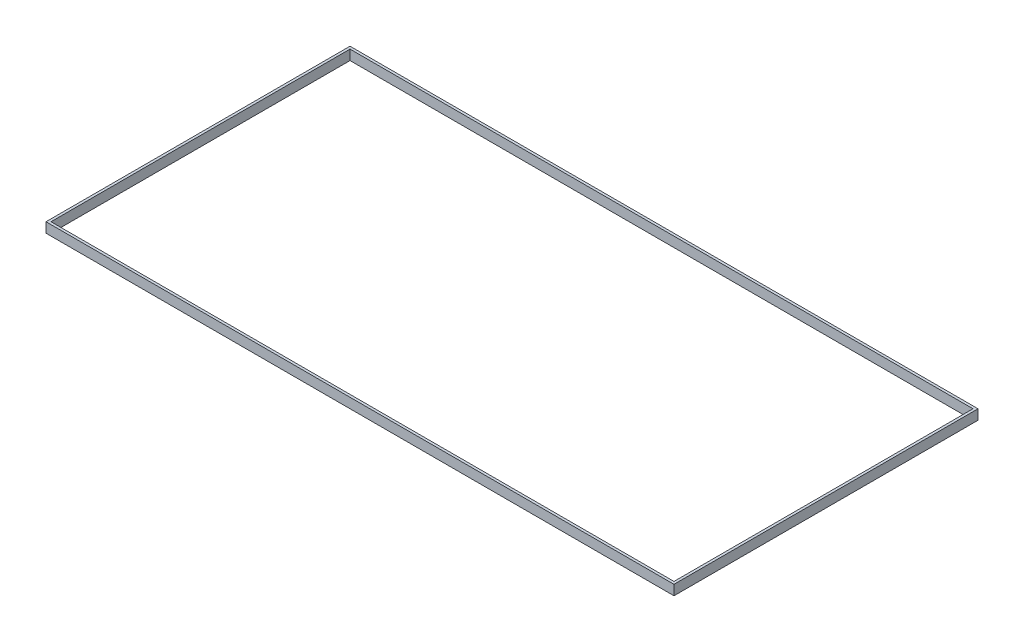
ISO-10303-21;
HEADER;
FILE_DESCRIPTION(('STEP AP214'),'2;1');
FILE_NAME('part.step','',(''),(''),'','','');
FILE_SCHEMA(('AUTOMOTIVE_DESIGN { 1 0 10303 214 1 1 1 1 }'));
ENDSEC;
DATA;
#1=APPLICATION_CONTEXT('core data for automotive mechanical design processes');
#2=APPLICATION_PROTOCOL_DEFINITION('international standard','automotive_design',2000,#1);
#3=PRODUCT_CONTEXT('',#1,'mechanical');
#4=PRODUCT('Part','Part','',(#3));
#5=PRODUCT_RELATED_PRODUCT_CATEGORY('part','',(#4));
#6=PRODUCT_DEFINITION_FORMATION('','',#4);
#7=PRODUCT_DEFINITION_CONTEXT('part definition',#1,'design');
#8=PRODUCT_DEFINITION('design','',#6,#7);
#9=PRODUCT_DEFINITION_SHAPE('','',#8);
#10=(LENGTH_UNIT() NAMED_UNIT(*) SI_UNIT(.MILLI.,.METRE.));
#11=(NAMED_UNIT(*) PLANE_ANGLE_UNIT() SI_UNIT($,.RADIAN.));
#12=(NAMED_UNIT(*) SI_UNIT($,.STERADIAN.) SOLID_ANGLE_UNIT());
#13=UNCERTAINTY_MEASURE_WITH_UNIT(LENGTH_MEASURE(1.E-05),#10,'distance_accuracy_value','');
#14=(GEOMETRIC_REPRESENTATION_CONTEXT(3) GLOBAL_UNCERTAINTY_ASSIGNED_CONTEXT((#13)) GLOBAL_UNIT_ASSIGNED_CONTEXT((#10,
#11,#12)) REPRESENTATION_CONTEXT('',''));
#15=CARTESIAN_POINT('',(0.,0.,0.));
#16=DIRECTION('',(0.,0.,1.));
#17=DIRECTION('',(1.,0.,0.));
#18=AXIS2_PLACEMENT_3D('',#15,#16,#17);
#19=CARTESIAN_POINT('',(0.,20.,0.));
#20=DIRECTION('',(0.,1.,0.));
#21=DIRECTION('',(0.,0.,1.));
#22=AXIS2_PLACEMENT_3D('',#19,#20,#21);
#23=PLANE('',#22);
#24=DIRECTION('',(0.,0.,1.));
#25=VECTOR('',#24,1.);
#26=CARTESIAN_POINT('',(-630.,20.,305.));
#27=LINE('',#26,#25);
#28=CARTESIAN_POINT('',(-630.,20.,-305.));
#29=VERTEX_POINT('',#28);
#30=CARTESIAN_POINT('',(-630.,20.,305.));
#31=VERTEX_POINT('',#30);
#32=EDGE_CURVE('E134',#29,#31,#27,.T.);
#33=ORIENTED_EDGE('',*,*,#32,.T.);
#34=DIRECTION('',(1.,0.,0.));
#35=VECTOR('',#34,1.);
#36=CARTESIAN_POINT('',(630.,20.,305.));
#37=LINE('',#36,#35);
#38=CARTESIAN_POINT('',(630.,20.,305.));
#39=VERTEX_POINT('',#38);
#40=EDGE_CURVE('E137',#31,#39,#37,.T.);
#41=ORIENTED_EDGE('',*,*,#40,.T.);
#42=DIRECTION('',(0.,0.,-1.));
#43=VECTOR('',#42,1.);
#44=CARTESIAN_POINT('',(630.,20.,305.));
#45=LINE('',#44,#43);
#46=CARTESIAN_POINT('',(630.,20.,-305.));
#47=VERTEX_POINT('',#46);
#48=EDGE_CURVE('E140',#39,#47,#45,.T.);
#49=ORIENTED_EDGE('',*,*,#48,.T.);
#50=DIRECTION('',(-1.,0.,0.));
#51=VECTOR('',#50,1.);
#52=CARTESIAN_POINT('',(630.,20.,-305.));
#53=LINE('',#52,#51);
#54=EDGE_CURVE('E142',#47,#29,#53,.T.);
#55=ORIENTED_EDGE('',*,*,#54,.T.);
#56=EDGE_LOOP('',(#33,#41,#49,#55));
#57=FACE_BOUND('',#56,.T.);
#58=DIRECTION('',(1.,0.,0.));
#59=VECTOR('',#58,1.);
#60=CARTESIAN_POINT('',(625.,20.,300.));
#61=LINE('',#60,#59);
#62=CARTESIAN_POINT('',(-625.,20.,300.));
#63=VERTEX_POINT('',#62);
#64=CARTESIAN_POINT('',(625.,20.,300.));
#65=VERTEX_POINT('',#64);
#66=EDGE_CURVE('E106',#63,#65,#61,.T.);
#67=ORIENTED_EDGE('',*,*,#66,.F.);
#68=DIRECTION('',(0.,0.,1.));
#69=VECTOR('',#68,1.);
#70=CARTESIAN_POINT('',(-625.,20.,300.));
#71=LINE('',#70,#69);
#72=CARTESIAN_POINT('',(-625.,20.,-300.));
#73=VERTEX_POINT('',#72);
#74=EDGE_CURVE('E98',#73,#63,#71,.T.);
#75=ORIENTED_EDGE('',*,*,#74,.F.);
#76=DIRECTION('',(-1.,0.,0.));
#77=VECTOR('',#76,1.);
#78=CARTESIAN_POINT('',(625.,20.,-300.));
#79=LINE('',#78,#77);
#80=CARTESIAN_POINT('',(625.,20.,-300.));
#81=VERTEX_POINT('',#80);
#82=EDGE_CURVE('E120',#81,#73,#79,.T.);
#83=ORIENTED_EDGE('',*,*,#82,.F.);
#84=DIRECTION('',(0.,0.,-1.));
#85=VECTOR('',#84,1.);
#86=CARTESIAN_POINT('',(625.,20.,300.));
#87=LINE('',#86,#85);
#88=EDGE_CURVE('E118',#65,#81,#87,.T.);
#89=ORIENTED_EDGE('',*,*,#88,.F.);
#90=EDGE_LOOP('',(#67,#75,#83,#89));
#91=FACE_BOUND('',#90,.T.);
#92=ADVANCED_FACE('F33',(#57,#91),#23,.T.);
#93=CARTESIAN_POINT('',(0.,0.,0.));
#94=DIRECTION('',(0.,1.,0.));
#95=DIRECTION('',(0.,0.,1.));
#96=AXIS2_PLACEMENT_3D('',#93,#94,#95);
#97=PLANE('',#96);
#98=DIRECTION('',(0.,0.,1.));
#99=VECTOR('',#98,1.);
#100=CARTESIAN_POINT('',(-630.,0.,305.));
#101=LINE('',#100,#99);
#102=CARTESIAN_POINT('',(-630.,0.,-305.));
#103=VERTEX_POINT('',#102);
#104=CARTESIAN_POINT('',(-630.,0.,305.));
#105=VERTEX_POINT('',#104);
#106=EDGE_CURVE('E114',#103,#105,#101,.T.);
#107=ORIENTED_EDGE('',*,*,#106,.F.);
#108=DIRECTION('',(-1.,0.,0.));
#109=VECTOR('',#108,1.);
#110=CARTESIAN_POINT('',(630.,0.,-305.));
#111=LINE('',#110,#109);
#112=CARTESIAN_POINT('',(630.,0.,-305.));
#113=VERTEX_POINT('',#112);
#114=EDGE_CURVE('E138',#113,#103,#111,.T.);
#115=ORIENTED_EDGE('',*,*,#114,.F.);
#116=DIRECTION('',(0.,0.,-1.));
#117=VECTOR('',#116,1.);
#118=CARTESIAN_POINT('',(630.,0.,305.));
#119=LINE('',#118,#117);
#120=CARTESIAN_POINT('',(630.,0.,305.));
#121=VERTEX_POINT('',#120);
#122=EDGE_CURVE('E149',#121,#113,#119,.T.);
#123=ORIENTED_EDGE('',*,*,#122,.F.);
#124=DIRECTION('',(1.,0.,0.));
#125=VECTOR('',#124,1.);
#126=CARTESIAN_POINT('',(630.,0.,305.));
#127=LINE('',#126,#125);
#128=EDGE_CURVE('E147',#105,#121,#127,.T.);
#129=ORIENTED_EDGE('',*,*,#128,.F.);
#130=EDGE_LOOP('',(#107,#115,#123,#129));
#131=FACE_BOUND('',#130,.T.);
#132=DIRECTION('',(0.,0.,1.));
#133=VECTOR('',#132,1.);
#134=CARTESIAN_POINT('',(-625.,0.,300.));
#135=LINE('',#134,#133);
#136=CARTESIAN_POINT('',(-625.,0.,-300.));
#137=VERTEX_POINT('',#136);
#138=CARTESIAN_POINT('',(-625.,0.,300.));
#139=VERTEX_POINT('',#138);
#140=EDGE_CURVE('E56',#137,#139,#135,.T.);
#141=ORIENTED_EDGE('',*,*,#140,.T.);
#142=DIRECTION('',(1.,0.,0.));
#143=VECTOR('',#142,1.);
#144=CARTESIAN_POINT('',(625.,0.,300.));
#145=LINE('',#144,#143);
#146=CARTESIAN_POINT('',(625.,0.,300.));
#147=VERTEX_POINT('',#146);
#148=EDGE_CURVE('E113',#139,#147,#145,.T.);
#149=ORIENTED_EDGE('',*,*,#148,.T.);
#150=DIRECTION('',(0.,0.,-1.));
#151=VECTOR('',#150,1.);
#152=CARTESIAN_POINT('',(625.,0.,300.));
#153=LINE('',#152,#151);
#154=CARTESIAN_POINT('',(625.,0.,-300.));
#155=VERTEX_POINT('',#154);
#156=EDGE_CURVE('E126',#147,#155,#153,.T.);
#157=ORIENTED_EDGE('',*,*,#156,.T.);
#158=DIRECTION('',(-1.,0.,0.));
#159=VECTOR('',#158,1.);
#160=CARTESIAN_POINT('',(625.,0.,-300.));
#161=LINE('',#160,#159);
#162=EDGE_CURVE('E107',#155,#137,#161,.T.);
#163=ORIENTED_EDGE('',*,*,#162,.T.);
#164=EDGE_LOOP('',(#141,#149,#157,#163));
#165=FACE_BOUND('',#164,.T.);
#166=ADVANCED_FACE('F167',(#131,#165),#97,.F.);
#167=CARTESIAN_POINT('',(-630.,20.,305.));
#168=DIRECTION('',(1.,0.,0.));
#169=DIRECTION('',(0.,0.,-1.));
#170=AXIS2_PLACEMENT_3D('',#167,#168,#169);
#171=PLANE('',#170);
#172=ORIENTED_EDGE('',*,*,#106,.T.);
#173=DIRECTION('',(0.,-1.,0.));
#174=VECTOR('',#173,1.);
#175=CARTESIAN_POINT('',(-630.,20.,305.));
#176=LINE('',#175,#174);
#177=EDGE_CURVE('E11',#31,#105,#176,.T.);
#178=ORIENTED_EDGE('',*,*,#177,.F.);
#179=ORIENTED_EDGE('',*,*,#32,.F.);
#180=DIRECTION('',(0.,-1.,0.));
#181=VECTOR('',#180,1.);
#182=CARTESIAN_POINT('',(-630.,20.,-305.));
#183=LINE('',#182,#181);
#184=EDGE_CURVE('E144',#29,#103,#183,.T.);
#185=ORIENTED_EDGE('',*,*,#184,.T.);
#186=EDGE_LOOP('',(#172,#178,#179,#185));
#187=FACE_BOUND('',#186,.T.);
#188=ADVANCED_FACE('F35',(#187),#171,.F.);
#189=CARTESIAN_POINT('',(630.,20.,305.));
#190=DIRECTION('',(0.,0.,-1.));
#191=DIRECTION('',(-1.,0.,0.));
#192=AXIS2_PLACEMENT_3D('',#189,#190,#191);
#193=PLANE('',#192);
#194=ORIENTED_EDGE('',*,*,#128,.T.);
#195=DIRECTION('',(0.,-1.,0.));
#196=VECTOR('',#195,1.);
#197=CARTESIAN_POINT('',(630.,20.,305.));
#198=LINE('',#197,#196);
#199=EDGE_CURVE('E41',#39,#121,#198,.T.);
#200=ORIENTED_EDGE('',*,*,#199,.F.);
#201=ORIENTED_EDGE('',*,*,#40,.F.);
#202=ORIENTED_EDGE('',*,*,#177,.T.);
#203=EDGE_LOOP('',(#194,#200,#201,#202));
#204=FACE_BOUND('',#203,.T.);
#205=ADVANCED_FACE('F177',(#204),#193,.F.);
#206=CARTESIAN_POINT('',(630.,20.,305.));
#207=DIRECTION('',(-1.,0.,0.));
#208=DIRECTION('',(0.,0.,1.));
#209=AXIS2_PLACEMENT_3D('',#206,#207,#208);
#210=PLANE('',#209);
#211=ORIENTED_EDGE('',*,*,#122,.T.);
#212=DIRECTION('',(0.,-1.,0.));
#213=VECTOR('',#212,1.);
#214=CARTESIAN_POINT('',(630.,20.,-305.));
#215=LINE('',#214,#213);
#216=EDGE_CURVE('E154',#47,#113,#215,.T.);
#217=ORIENTED_EDGE('',*,*,#216,.F.);
#218=ORIENTED_EDGE('',*,*,#48,.F.);
#219=ORIENTED_EDGE('',*,*,#199,.T.);
#220=EDGE_LOOP('',(#211,#217,#218,#219));
#221=FACE_BOUND('',#220,.T.);
#222=ADVANCED_FACE('F161',(#221),#210,.F.);
#223=CARTESIAN_POINT('',(630.,20.,-305.));
#224=DIRECTION('',(0.,0.,1.));
#225=DIRECTION('',(1.,0.,0.));
#226=AXIS2_PLACEMENT_3D('',#223,#224,#225);
#227=PLANE('',#226);
#228=ORIENTED_EDGE('',*,*,#114,.T.);
#229=ORIENTED_EDGE('',*,*,#184,.F.);
#230=ORIENTED_EDGE('',*,*,#54,.F.);
#231=ORIENTED_EDGE('',*,*,#216,.T.);
#232=EDGE_LOOP('',(#228,#229,#230,#231));
#233=FACE_BOUND('',#232,.T.);
#234=ADVANCED_FACE('F171',(#233),#227,.F.);
#235=CARTESIAN_POINT('',(-625.,20.,300.));
#236=DIRECTION('',(1.,0.,0.));
#237=DIRECTION('',(0.,0.,-1.));
#238=AXIS2_PLACEMENT_3D('',#235,#236,#237);
#239=PLANE('',#238);
#240=ORIENTED_EDGE('',*,*,#140,.F.);
#241=DIRECTION('',(0.,-1.,0.));
#242=VECTOR('',#241,1.);
#243=CARTESIAN_POINT('',(-625.,20.,-300.));
#244=LINE('',#243,#242);
#245=EDGE_CURVE('E102',#73,#137,#244,.T.);
#246=ORIENTED_EDGE('',*,*,#245,.F.);
#247=ORIENTED_EDGE('',*,*,#74,.T.);
#248=DIRECTION('',(0.,-1.,0.));
#249=VECTOR('',#248,1.);
#250=CARTESIAN_POINT('',(-625.,20.,300.));
#251=LINE('',#250,#249);
#252=EDGE_CURVE('E101',#63,#139,#251,.T.);
#253=ORIENTED_EDGE('',*,*,#252,.T.);
#254=EDGE_LOOP('',(#240,#246,#247,#253));
#255=FACE_BOUND('',#254,.T.);
#256=ADVANCED_FACE('F100',(#255),#239,.T.);
#257=CARTESIAN_POINT('',(625.,20.,300.));
#258=DIRECTION('',(0.,0.,-1.));
#259=DIRECTION('',(-1.,0.,0.));
#260=AXIS2_PLACEMENT_3D('',#257,#258,#259);
#261=PLANE('',#260);
#262=ORIENTED_EDGE('',*,*,#148,.F.);
#263=ORIENTED_EDGE('',*,*,#252,.F.);
#264=ORIENTED_EDGE('',*,*,#66,.T.);
#265=DIRECTION('',(0.,-1.,0.));
#266=VECTOR('',#265,1.);
#267=CARTESIAN_POINT('',(625.,20.,300.));
#268=LINE('',#267,#266);
#269=EDGE_CURVE('E115',#65,#147,#268,.T.);
#270=ORIENTED_EDGE('',*,*,#269,.T.);
#271=EDGE_LOOP('',(#262,#263,#264,#270));
#272=FACE_BOUND('',#271,.T.);
#273=ADVANCED_FACE('F110',(#272),#261,.T.);
#274=CARTESIAN_POINT('',(625.,20.,300.));
#275=DIRECTION('',(-1.,0.,0.));
#276=DIRECTION('',(0.,0.,1.));
#277=AXIS2_PLACEMENT_3D('',#274,#275,#276);
#278=PLANE('',#277);
#279=ORIENTED_EDGE('',*,*,#156,.F.);
#280=ORIENTED_EDGE('',*,*,#269,.F.);
#281=ORIENTED_EDGE('',*,*,#88,.T.);
#282=DIRECTION('',(0.,-1.,0.));
#283=VECTOR('',#282,1.);
#284=CARTESIAN_POINT('',(625.,20.,-300.));
#285=LINE('',#284,#283);
#286=EDGE_CURVE('E48',#81,#155,#285,.T.);
#287=ORIENTED_EDGE('',*,*,#286,.T.);
#288=EDGE_LOOP('',(#279,#280,#281,#287));
#289=FACE_BOUND('',#288,.T.);
#290=ADVANCED_FACE('F200',(#289),#278,.T.);
#291=CARTESIAN_POINT('',(625.,20.,-300.));
#292=DIRECTION('',(0.,0.,1.));
#293=DIRECTION('',(1.,0.,0.));
#294=AXIS2_PLACEMENT_3D('',#291,#292,#293);
#295=PLANE('',#294);
#296=ORIENTED_EDGE('',*,*,#162,.F.);
#297=ORIENTED_EDGE('',*,*,#286,.F.);
#298=ORIENTED_EDGE('',*,*,#82,.T.);
#299=ORIENTED_EDGE('',*,*,#245,.T.);
#300=EDGE_LOOP('',(#296,#297,#298,#299));
#301=FACE_BOUND('',#300,.T.);
#302=ADVANCED_FACE('F204',(#301),#295,.T.);
#303=CLOSED_SHELL('',(#92,#166,#188,#205,#222,#234,#256,#273,#290,#302));
#304=MANIFOLD_SOLID_BREP('B2',#303);
#305=ADVANCED_BREP_SHAPE_REPRESENTATION('',(#18,#304),#14);
#306=SHAPE_DEFINITION_REPRESENTATION(#9,#305);
ENDSEC;
END-ISO-10303-21;
